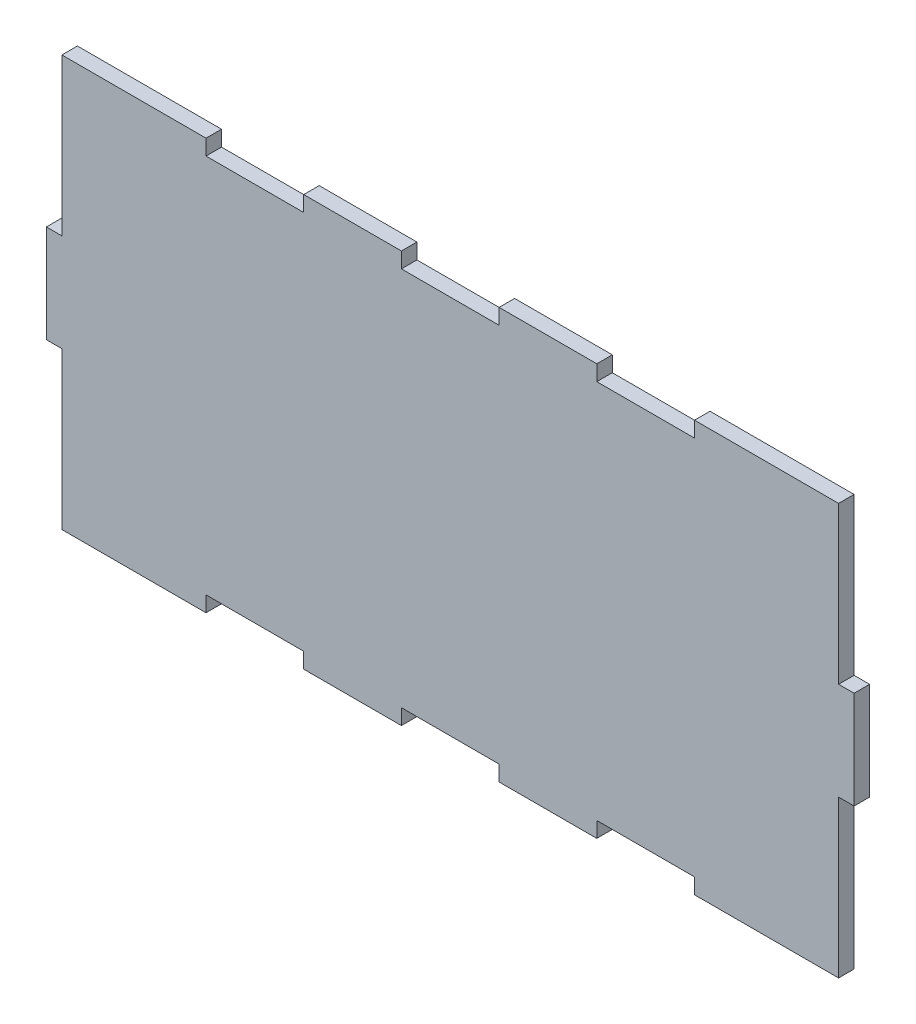
ISO-10303-21;
HEADER;
FILE_DESCRIPTION(('STEP AP214'),'2;1');
FILE_NAME('part.step','',(''),(''),'','','');
FILE_SCHEMA(('AUTOMOTIVE_DESIGN { 1 0 10303 214 1 1 1 1 }'));
ENDSEC;
DATA;
#1=APPLICATION_CONTEXT('core data for automotive mechanical design processes');
#2=APPLICATION_PROTOCOL_DEFINITION('international standard','automotive_design',2000,#1);
#3=PRODUCT_CONTEXT('',#1,'mechanical');
#4=PRODUCT('Part','Part','',(#3));
#5=PRODUCT_RELATED_PRODUCT_CATEGORY('part','',(#4));
#6=PRODUCT_DEFINITION_FORMATION('','',#4);
#7=PRODUCT_DEFINITION_CONTEXT('part definition',#1,'design');
#8=PRODUCT_DEFINITION('design','',#6,#7);
#9=PRODUCT_DEFINITION_SHAPE('','',#8);
#10=(LENGTH_UNIT() NAMED_UNIT(*) SI_UNIT(.MILLI.,.METRE.));
#11=(NAMED_UNIT(*) PLANE_ANGLE_UNIT() SI_UNIT($,.RADIAN.));
#12=(NAMED_UNIT(*) SI_UNIT($,.STERADIAN.) SOLID_ANGLE_UNIT());
#13=UNCERTAINTY_MEASURE_WITH_UNIT(LENGTH_MEASURE(1.E-05),#10,'distance_accuracy_value','');
#14=(GEOMETRIC_REPRESENTATION_CONTEXT(3) GLOBAL_UNCERTAINTY_ASSIGNED_CONTEXT((#13)) GLOBAL_UNIT_ASSIGNED_CONTEXT((#10,
#11,#12)) REPRESENTATION_CONTEXT('',''));
#15=CARTESIAN_POINT('',(0.,0.,0.));
#16=DIRECTION('',(0.,0.,1.));
#17=DIRECTION('',(1.,0.,0.));
#18=AXIS2_PLACEMENT_3D('',#15,#16,#17);
#19=CARTESIAN_POINT('',(-82.675,42.073,3.175));
#20=DIRECTION('',(0.,-1.,0.));
#21=DIRECTION('',(0.,0.,-1.));
#22=AXIS2_PLACEMENT_3D('',#19,#20,#21);
#23=PLANE('',#22);
#24=DIRECTION('',(0.,0.,1.));
#25=VECTOR('',#24,1.);
#26=CARTESIAN_POINT('',(-30.,42.073,0.));
#27=LINE('',#26,#25);
#28=CARTESIAN_POINT('',(-30.,42.073,0.));
#29=VERTEX_POINT('',#28);
#30=CARTESIAN_POINT('',(-30.,42.073,3.175));
#31=VERTEX_POINT('',#30);
#32=EDGE_CURVE('E357',#29,#31,#27,.T.);
#33=ORIENTED_EDGE('',*,*,#32,.T.);
#34=DIRECTION('',(-1.,0.,0.));
#35=VECTOR('',#34,1.);
#36=CARTESIAN_POINT('',(-82.675,42.073,3.175));
#37=LINE('',#36,#35);
#38=CARTESIAN_POINT('',(-9.99999999999999,42.073,3.175));
#39=VERTEX_POINT('',#38);
#40=EDGE_CURVE('E604',#39,#31,#37,.T.);
#41=ORIENTED_EDGE('',*,*,#40,.F.);
#42=DIRECTION('',(0.,0.,1.));
#43=VECTOR('',#42,1.);
#44=CARTESIAN_POINT('',(-9.99999999999999,42.073,0.));
#45=LINE('',#44,#43);
#46=CARTESIAN_POINT('',(-9.99999999999999,42.073,0.));
#47=VERTEX_POINT('',#46);
#48=EDGE_CURVE('E400',#47,#39,#45,.T.);
#49=ORIENTED_EDGE('',*,*,#48,.F.);
#50=DIRECTION('',(-1.,0.,0.));
#51=VECTOR('',#50,1.);
#52=CARTESIAN_POINT('',(-82.675,42.073,0.));
#53=LINE('',#52,#51);
#54=EDGE_CURVE('E583',#47,#29,#53,.T.);
#55=ORIENTED_EDGE('',*,*,#54,.T.);
#56=EDGE_LOOP('',(#33,#41,#49,#55));
#57=FACE_BOUND('',#56,.T.);
#58=ADVANCED_FACE('F41',(#57),#23,.F.);
#59=DIRECTION('',(0.,0.,1.));
#60=VECTOR('',#59,1.);
#61=CARTESIAN_POINT('',(-50.,42.073,0.));
#62=LINE('',#61,#60);
#63=CARTESIAN_POINT('',(-50.,42.073,0.));
#64=VERTEX_POINT('',#63);
#65=CARTESIAN_POINT('',(-50.,42.073,3.175));
#66=VERTEX_POINT('',#65);
#67=EDGE_CURVE('E375',#64,#66,#62,.T.);
#68=ORIENTED_EDGE('',*,*,#67,.F.);
#69=CARTESIAN_POINT('',(-79.5,42.073,0.));
#70=VERTEX_POINT('',#69);
#71=EDGE_CURVE('E578',#64,#70,#53,.T.);
#72=ORIENTED_EDGE('',*,*,#71,.T.);
#73=DIRECTION('',(0.,0.,1.));
#74=VECTOR('',#73,1.);
#75=CARTESIAN_POINT('',(-79.5,42.073,0.));
#76=LINE('',#75,#74);
#77=CARTESIAN_POINT('',(-79.5,42.073,3.175));
#78=VERTEX_POINT('',#77);
#79=EDGE_CURVE('E542',#70,#78,#76,.T.);
#80=ORIENTED_EDGE('',*,*,#79,.T.);
#81=EDGE_CURVE('E326',#66,#78,#37,.T.);
#82=ORIENTED_EDGE('',*,*,#81,.F.);
#83=EDGE_LOOP('',(#68,#72,#80,#82));
#84=FACE_BOUND('',#83,.T.);
#85=ADVANCED_FACE('F735',(#84),#23,.F.);
#86=DIRECTION('',(0.,0.,1.));
#87=VECTOR('',#86,1.);
#88=CARTESIAN_POINT('',(30.,42.073,0.));
#89=LINE('',#88,#87);
#90=CARTESIAN_POINT('',(30.,42.073,0.));
#91=VERTEX_POINT('',#90);
#92=CARTESIAN_POINT('',(30.,42.073,3.175));
#93=VERTEX_POINT('',#92);
#94=EDGE_CURVE('E343',#91,#93,#89,.T.);
#95=ORIENTED_EDGE('',*,*,#94,.F.);
#96=CARTESIAN_POINT('',(9.99999999999999,42.073,0.));
#97=VERTEX_POINT('',#96);
#98=EDGE_CURVE('E297',#91,#97,#53,.T.);
#99=ORIENTED_EDGE('',*,*,#98,.T.);
#100=DIRECTION('',(0.,0.,1.));
#101=VECTOR('',#100,1.);
#102=CARTESIAN_POINT('',(9.99999999999999,42.073,0.));
#103=LINE('',#102,#101);
#104=CARTESIAN_POINT('',(9.99999999999999,42.073,3.175));
#105=VERTEX_POINT('',#104);
#106=EDGE_CURVE('E403',#97,#105,#103,.T.);
#107=ORIENTED_EDGE('',*,*,#106,.T.);
#108=EDGE_CURVE('E325',#93,#105,#37,.T.);
#109=ORIENTED_EDGE('',*,*,#108,.F.);
#110=EDGE_LOOP('',(#95,#99,#107,#109));
#111=FACE_BOUND('',#110,.T.);
#112=ADVANCED_FACE('F597',(#111),#23,.F.);
#113=DIRECTION('',(0.,0.,1.));
#114=VECTOR('',#113,1.);
#115=CARTESIAN_POINT('',(50.,42.073,0.));
#116=LINE('',#115,#114);
#117=CARTESIAN_POINT('',(50.,42.073,0.));
#118=VERTEX_POINT('',#117);
#119=CARTESIAN_POINT('',(50.,42.073,3.175));
#120=VERTEX_POINT('',#119);
#121=EDGE_CURVE('E346',#118,#120,#116,.T.);
#122=ORIENTED_EDGE('',*,*,#121,.T.);
#123=CARTESIAN_POINT('',(79.5,42.073,3.175));
#124=VERTEX_POINT('',#123);
#125=EDGE_CURVE('E318',#124,#120,#37,.T.);
#126=ORIENTED_EDGE('',*,*,#125,.F.);
#127=DIRECTION('',(0.,0.,1.));
#128=VECTOR('',#127,1.);
#129=CARTESIAN_POINT('',(79.5,42.073,0.));
#130=LINE('',#129,#128);
#131=CARTESIAN_POINT('',(79.5,42.073,0.));
#132=VERTEX_POINT('',#131);
#133=EDGE_CURVE('E512',#132,#124,#130,.T.);
#134=ORIENTED_EDGE('',*,*,#133,.F.);
#135=EDGE_CURVE('E584',#132,#118,#53,.T.);
#136=ORIENTED_EDGE('',*,*,#135,.T.);
#137=EDGE_LOOP('',(#122,#126,#134,#136));
#138=FACE_BOUND('',#137,.T.);
#139=ADVANCED_FACE('F737',(#138),#23,.F.);
#140=CARTESIAN_POINT('',(0.,0.,3.175));
#141=DIRECTION('',(0.,0.,-1.));
#142=DIRECTION('',(-1.,0.,0.));
#143=AXIS2_PLACEMENT_3D('',#140,#141,#142);
#144=PLANE('',#143);
#145=DIRECTION('',(0.,-1.,0.));
#146=VECTOR('',#145,1.);
#147=CARTESIAN_POINT('',(-30.,42.073,3.175));
#148=LINE('',#147,#146);
#149=CARTESIAN_POINT('',(-30.,38.898,3.175));
#150=VERTEX_POINT('',#149);
#151=EDGE_CURVE('E358',#31,#150,#148,.T.);
#152=ORIENTED_EDGE('',*,*,#151,.T.);
#153=DIRECTION('',(-1.,0.,0.));
#154=VECTOR('',#153,1.);
#155=CARTESIAN_POINT('',(-30.,38.898,3.175));
#156=LINE('',#155,#154);
#157=CARTESIAN_POINT('',(-50.,38.898,3.175));
#158=VERTEX_POINT('',#157);
#159=EDGE_CURVE('E353',#150,#158,#156,.T.);
#160=ORIENTED_EDGE('',*,*,#159,.T.);
#161=DIRECTION('',(0.,1.,0.));
#162=VECTOR('',#161,1.);
#163=CARTESIAN_POINT('',(-50.,42.073,3.175));
#164=LINE('',#163,#162);
#165=EDGE_CURVE('E363',#158,#66,#164,.T.);
#166=ORIENTED_EDGE('',*,*,#165,.T.);
#167=ORIENTED_EDGE('',*,*,#81,.T.);
#168=DIRECTION('',(0.,1.,0.));
#169=VECTOR('',#168,1.);
#170=CARTESIAN_POINT('',(-79.5,10.,3.175));
#171=LINE('',#170,#169);
#172=CARTESIAN_POINT('',(-79.5,10.,3.175));
#173=VERTEX_POINT('',#172);
#174=EDGE_CURVE('E554',#173,#78,#171,.T.);
#175=ORIENTED_EDGE('',*,*,#174,.F.);
#176=DIRECTION('',(1.,0.,0.));
#177=VECTOR('',#176,1.);
#178=CARTESIAN_POINT('',(-82.675,10.,3.175));
#179=LINE('',#178,#177);
#180=CARTESIAN_POINT('',(-82.675,10.,3.175));
#181=VERTEX_POINT('',#180);
#182=EDGE_CURVE('E501',#181,#173,#179,.T.);
#183=ORIENTED_EDGE('',*,*,#182,.F.);
#184=DIRECTION('',(0.,-1.,0.));
#185=VECTOR('',#184,1.);
#186=CARTESIAN_POINT('',(-82.675,42.073,3.175));
#187=LINE('',#186,#185);
#188=CARTESIAN_POINT('',(-82.675,-10.,3.175));
#189=VERTEX_POINT('',#188);
#190=EDGE_CURVE('E324',#181,#189,#187,.T.);
#191=ORIENTED_EDGE('',*,*,#190,.T.);
#192=DIRECTION('',(-1.,0.,0.));
#193=VECTOR('',#192,1.);
#194=CARTESIAN_POINT('',(-82.675,-10.,3.175));
#195=LINE('',#194,#193);
#196=CARTESIAN_POINT('',(-79.5,-10.,3.175));
#197=VERTEX_POINT('',#196);
#198=EDGE_CURVE('E533',#197,#189,#195,.T.);
#199=ORIENTED_EDGE('',*,*,#198,.F.);
#200=DIRECTION('',(0.,1.,0.));
#201=VECTOR('',#200,1.);
#202=CARTESIAN_POINT('',(-79.5,-42.073,3.175));
#203=LINE('',#202,#201);
#204=CARTESIAN_POINT('',(-79.5,-42.073,3.175));
#205=VERTEX_POINT('',#204);
#206=EDGE_CURVE('E537',#205,#197,#203,.T.);
#207=ORIENTED_EDGE('',*,*,#206,.F.);
#208=DIRECTION('',(1.,0.,0.));
#209=VECTOR('',#208,1.);
#210=CARTESIAN_POINT('',(-82.675,-42.073,3.175));
#211=LINE('',#210,#209);
#212=CARTESIAN_POINT('',(-50.,-42.073,3.175));
#213=VERTEX_POINT('',#212);
#214=EDGE_CURVE('E50',#205,#213,#211,.T.);
#215=ORIENTED_EDGE('',*,*,#214,.T.);
#216=DIRECTION('',(0.,-1.,0.));
#217=VECTOR('',#216,1.);
#218=CARTESIAN_POINT('',(-50.,-42.073,3.175));
#219=LINE('',#218,#217);
#220=CARTESIAN_POINT('',(-50.,-38.898,3.175));
#221=VERTEX_POINT('',#220);
#222=EDGE_CURVE('E451',#221,#213,#219,.T.);
#223=ORIENTED_EDGE('',*,*,#222,.F.);
#224=DIRECTION('',(-1.,0.,0.));
#225=VECTOR('',#224,1.);
#226=CARTESIAN_POINT('',(-30.,-38.898,3.175));
#227=LINE('',#226,#225);
#228=CARTESIAN_POINT('',(-30.,-38.898,3.175));
#229=VERTEX_POINT('',#228);
#230=EDGE_CURVE('E462',#229,#221,#227,.T.);
#231=ORIENTED_EDGE('',*,*,#230,.F.);
#232=DIRECTION('',(0.,1.,0.));
#233=VECTOR('',#232,1.);
#234=CARTESIAN_POINT('',(-30.,-42.073,3.175));
#235=LINE('',#234,#233);
#236=CARTESIAN_POINT('',(-30.,-42.073,3.175));
#237=VERTEX_POINT('',#236);
#238=EDGE_CURVE('E402',#237,#229,#235,.T.);
#239=ORIENTED_EDGE('',*,*,#238,.F.);
#240=CARTESIAN_POINT('',(-9.99999999999999,-42.073,3.175));
#241=VERTEX_POINT('',#240);
#242=EDGE_CURVE('E475',#237,#241,#211,.T.);
#243=ORIENTED_EDGE('',*,*,#242,.T.);
#244=DIRECTION('',(0.,-1.,0.));
#245=VECTOR('',#244,1.);
#246=CARTESIAN_POINT('',(-9.99999999999999,-42.073,3.175));
#247=LINE('',#246,#245);
#248=CARTESIAN_POINT('',(-10.,-38.898,3.175));
#249=VERTEX_POINT('',#248);
#250=EDGE_CURVE('E440',#249,#241,#247,.T.);
#251=ORIENTED_EDGE('',*,*,#250,.F.);
#252=DIRECTION('',(-1.,0.,0.));
#253=VECTOR('',#252,1.);
#254=CARTESIAN_POINT('',(-10.,-38.898,3.175));
#255=LINE('',#254,#253);
#256=CARTESIAN_POINT('',(9.99999999999999,-38.898,3.175));
#257=VERTEX_POINT('',#256);
#258=EDGE_CURVE('E684',#257,#249,#255,.T.);
#259=ORIENTED_EDGE('',*,*,#258,.F.);
#260=DIRECTION('',(0.,1.,0.));
#261=VECTOR('',#260,1.);
#262=CARTESIAN_POINT('',(9.99999999999999,-42.073,3.175));
#263=LINE('',#262,#261);
#264=CARTESIAN_POINT('',(9.99999999999999,-42.073,3.175));
#265=VERTEX_POINT('',#264);
#266=EDGE_CURVE('E651',#265,#257,#263,.T.);
#267=ORIENTED_EDGE('',*,*,#266,.F.);
#268=CARTESIAN_POINT('',(30.,-42.073,3.175));
#269=VERTEX_POINT('',#268);
#270=EDGE_CURVE('E648',#265,#269,#211,.T.);
#271=ORIENTED_EDGE('',*,*,#270,.T.);
#272=DIRECTION('',(0.,-1.,0.));
#273=VECTOR('',#272,1.);
#274=CARTESIAN_POINT('',(30.,-42.073,3.175));
#275=LINE('',#274,#273);
#276=CARTESIAN_POINT('',(30.,-38.898,3.175));
#277=VERTEX_POINT('',#276);
#278=EDGE_CURVE('E420',#277,#269,#275,.T.);
#279=ORIENTED_EDGE('',*,*,#278,.F.);
#280=DIRECTION('',(-1.,0.,0.));
#281=VECTOR('',#280,1.);
#282=CARTESIAN_POINT('',(30.,-38.898,3.175));
#283=LINE('',#282,#281);
#284=CARTESIAN_POINT('',(50.,-38.898,3.175));
#285=VERTEX_POINT('',#284);
#286=EDGE_CURVE('E413',#285,#277,#283,.T.);
#287=ORIENTED_EDGE('',*,*,#286,.F.);
#288=DIRECTION('',(0.,1.,0.));
#289=VECTOR('',#288,1.);
#290=CARTESIAN_POINT('',(50.,-42.073,3.175));
#291=LINE('',#290,#289);
#292=CARTESIAN_POINT('',(50.,-42.073,3.175));
#293=VERTEX_POINT('',#292);
#294=EDGE_CURVE('E424',#293,#285,#291,.T.);
#295=ORIENTED_EDGE('',*,*,#294,.F.);
#296=CARTESIAN_POINT('',(79.5,-42.073,3.175));
#297=VERTEX_POINT('',#296);
#298=EDGE_CURVE('E476',#293,#297,#211,.T.);
#299=ORIENTED_EDGE('',*,*,#298,.T.);
#300=DIRECTION('',(0.,1.,0.));
#301=VECTOR('',#300,1.);
#302=CARTESIAN_POINT('',(79.5,-42.073,3.175));
#303=LINE('',#302,#301);
#304=CARTESIAN_POINT('',(79.5,-10.,3.175));
#305=VERTEX_POINT('',#304);
#306=EDGE_CURVE('E489',#297,#305,#303,.T.);
#307=ORIENTED_EDGE('',*,*,#306,.T.);
#308=DIRECTION('',(1.,0.,0.));
#309=VECTOR('',#308,1.);
#310=CARTESIAN_POINT('',(82.675,-10.,3.175));
#311=LINE('',#310,#309);
#312=CARTESIAN_POINT('',(82.675,-10.,3.175));
#313=VERTEX_POINT('',#312);
#314=EDGE_CURVE('E495',#305,#313,#311,.T.);
#315=ORIENTED_EDGE('',*,*,#314,.T.);
#316=DIRECTION('',(0.,1.,0.));
#317=VECTOR('',#316,1.);
#318=CARTESIAN_POINT('',(82.675,42.073,3.175));
#319=LINE('',#318,#317);
#320=CARTESIAN_POINT('',(82.675,10.,3.175));
#321=VERTEX_POINT('',#320);
#322=EDGE_CURVE('E12',#313,#321,#319,.T.);
#323=ORIENTED_EDGE('',*,*,#322,.T.);
#324=DIRECTION('',(-1.,0.,0.));
#325=VECTOR('',#324,1.);
#326=CARTESIAN_POINT('',(82.675,10.,3.175));
#327=LINE('',#326,#325);
#328=CARTESIAN_POINT('',(79.5,10.,3.175));
#329=VERTEX_POINT('',#328);
#330=EDGE_CURVE('E510',#321,#329,#327,.T.);
#331=ORIENTED_EDGE('',*,*,#330,.T.);
#332=DIRECTION('',(0.,1.,0.));
#333=VECTOR('',#332,1.);
#334=CARTESIAN_POINT('',(79.5,10.,3.175));
#335=LINE('',#334,#333);
#336=EDGE_CURVE('E513',#329,#124,#335,.T.);
#337=ORIENTED_EDGE('',*,*,#336,.T.);
#338=ORIENTED_EDGE('',*,*,#125,.T.);
#339=DIRECTION('',(0.,-1.,0.));
#340=VECTOR('',#339,1.);
#341=CARTESIAN_POINT('',(50.,42.073,3.175));
#342=LINE('',#341,#340);
#343=CARTESIAN_POINT('',(50.,38.898,3.175));
#344=VERTEX_POINT('',#343);
#345=EDGE_CURVE('E298',#120,#344,#342,.T.);
#346=ORIENTED_EDGE('',*,*,#345,.T.);
#347=DIRECTION('',(-1.,0.,0.));
#348=VECTOR('',#347,1.);
#349=CARTESIAN_POINT('',(30.,38.898,3.175));
#350=LINE('',#349,#348);
#351=CARTESIAN_POINT('',(30.,38.898,3.175));
#352=VERTEX_POINT('',#351);
#353=EDGE_CURVE('E302',#344,#352,#350,.T.);
#354=ORIENTED_EDGE('',*,*,#353,.T.);
#355=DIRECTION('',(0.,1.,0.));
#356=VECTOR('',#355,1.);
#357=CARTESIAN_POINT('',(30.,42.073,3.175));
#358=LINE('',#357,#356);
#359=EDGE_CURVE('E289',#352,#93,#358,.T.);
#360=ORIENTED_EDGE('',*,*,#359,.T.);
#361=ORIENTED_EDGE('',*,*,#108,.T.);
#362=DIRECTION('',(0.,-1.,0.));
#363=VECTOR('',#362,1.);
#364=CARTESIAN_POINT('',(9.99999999999999,42.073,3.175));
#365=LINE('',#364,#363);
#366=CARTESIAN_POINT('',(9.99999999999999,38.898,3.175));
#367=VERTEX_POINT('',#366);
#368=EDGE_CURVE('E382',#105,#367,#365,.T.);
#369=ORIENTED_EDGE('',*,*,#368,.T.);
#370=DIRECTION('',(-1.,0.,0.));
#371=VECTOR('',#370,1.);
#372=CARTESIAN_POINT('',(-10.,38.898,3.175));
#373=LINE('',#372,#371);
#374=CARTESIAN_POINT('',(-10.,38.898,3.175));
#375=VERTEX_POINT('',#374);
#376=EDGE_CURVE('E392',#367,#375,#373,.T.);
#377=ORIENTED_EDGE('',*,*,#376,.T.);
#378=DIRECTION('',(0.,1.,0.));
#379=VECTOR('',#378,1.);
#380=CARTESIAN_POINT('',(-9.99999999999999,42.073,3.175));
#381=LINE('',#380,#379);
#382=EDGE_CURVE('E345',#375,#39,#381,.T.);
#383=ORIENTED_EDGE('',*,*,#382,.T.);
#384=ORIENTED_EDGE('',*,*,#40,.T.);
#385=EDGE_LOOP('',(#152,#160,#166,#167,#175,#183,#191,#199,#207,#215,#223,#231,#239,#243,#251,
#259,#267,#271,#279,#287,#295,#299,#307,#315,#323,#331,#337,#338,#346,#354,#360,#361,#369,#377,
#383,#384));
#386=FACE_BOUND('',#385,.T.);
#387=ADVANCED_FACE('F601',(#386),#144,.F.);
#388=CARTESIAN_POINT('',(0.,0.,0.));
#389=DIRECTION('',(0.,0.,-1.));
#390=DIRECTION('',(-1.,0.,0.));
#391=AXIS2_PLACEMENT_3D('',#388,#389,#390);
#392=PLANE('',#391);
#393=DIRECTION('',(-1.,0.,0.));
#394=VECTOR('',#393,1.);
#395=CARTESIAN_POINT('',(-30.,38.898,0.));
#396=LINE('',#395,#394);
#397=CARTESIAN_POINT('',(-30.,38.898,0.));
#398=VERTEX_POINT('',#397);
#399=CARTESIAN_POINT('',(-50.,38.898,0.));
#400=VERTEX_POINT('',#399);
#401=EDGE_CURVE('E355',#398,#400,#396,.T.);
#402=ORIENTED_EDGE('',*,*,#401,.F.);
#403=DIRECTION('',(0.,-1.,0.));
#404=VECTOR('',#403,1.);
#405=CARTESIAN_POINT('',(-30.,42.073,0.));
#406=LINE('',#405,#404);
#407=EDGE_CURVE('E350',#29,#398,#406,.T.);
#408=ORIENTED_EDGE('',*,*,#407,.F.);
#409=ORIENTED_EDGE('',*,*,#54,.F.);
#410=DIRECTION('',(0.,1.,0.));
#411=VECTOR('',#410,1.);
#412=CARTESIAN_POINT('',(-9.99999999999999,42.073,0.));
#413=LINE('',#412,#411);
#414=CARTESIAN_POINT('',(-10.,38.898,0.));
#415=VERTEX_POINT('',#414);
#416=EDGE_CURVE('E379',#415,#47,#413,.T.);
#417=ORIENTED_EDGE('',*,*,#416,.F.);
#418=DIRECTION('',(-1.,0.,0.));
#419=VECTOR('',#418,1.);
#420=CARTESIAN_POINT('',(-10.,38.898,0.));
#421=LINE('',#420,#419);
#422=CARTESIAN_POINT('',(9.99999999999999,38.898,0.));
#423=VERTEX_POINT('',#422);
#424=EDGE_CURVE('E381',#423,#415,#421,.T.);
#425=ORIENTED_EDGE('',*,*,#424,.F.);
#426=DIRECTION('',(0.,-1.,0.));
#427=VECTOR('',#426,1.);
#428=CARTESIAN_POINT('',(9.99999999999999,42.073,0.));
#429=LINE('',#428,#427);
#430=EDGE_CURVE('E384',#97,#423,#429,.T.);
#431=ORIENTED_EDGE('',*,*,#430,.F.);
#432=ORIENTED_EDGE('',*,*,#98,.F.);
#433=DIRECTION('',(0.,1.,0.));
#434=VECTOR('',#433,1.);
#435=CARTESIAN_POINT('',(30.,42.073,0.));
#436=LINE('',#435,#434);
#437=CARTESIAN_POINT('',(30.,38.898,0.));
#438=VERTEX_POINT('',#437);
#439=EDGE_CURVE('E283',#438,#91,#436,.T.);
#440=ORIENTED_EDGE('',*,*,#439,.F.);
#441=DIRECTION('',(-1.,0.,0.));
#442=VECTOR('',#441,1.);
#443=CARTESIAN_POINT('',(30.,38.898,0.));
#444=LINE('',#443,#442);
#445=CARTESIAN_POINT('',(50.,38.898,0.));
#446=VERTEX_POINT('',#445);
#447=EDGE_CURVE('E274',#446,#438,#444,.T.);
#448=ORIENTED_EDGE('',*,*,#447,.F.);
#449=DIRECTION('',(0.,-1.,0.));
#450=VECTOR('',#449,1.);
#451=CARTESIAN_POINT('',(50.,42.073,0.));
#452=LINE('',#451,#450);
#453=EDGE_CURVE('E282',#118,#446,#452,.T.);
#454=ORIENTED_EDGE('',*,*,#453,.F.);
#455=ORIENTED_EDGE('',*,*,#135,.F.);
#456=DIRECTION('',(0.,1.,0.));
#457=VECTOR('',#456,1.);
#458=CARTESIAN_POINT('',(79.5,10.,0.));
#459=LINE('',#458,#457);
#460=CARTESIAN_POINT('',(79.5,10.,0.));
#461=VERTEX_POINT('',#460);
#462=EDGE_CURVE('E507',#461,#132,#459,.T.);
#463=ORIENTED_EDGE('',*,*,#462,.F.);
#464=DIRECTION('',(-1.,0.,0.));
#465=VECTOR('',#464,1.);
#466=CARTESIAN_POINT('',(82.675,10.,0.));
#467=LINE('',#466,#465);
#468=CARTESIAN_POINT('',(82.675,10.,0.));
#469=VERTEX_POINT('',#468);
#470=EDGE_CURVE('E509',#469,#461,#467,.T.);
#471=ORIENTED_EDGE('',*,*,#470,.F.);
#472=DIRECTION('',(0.,1.,0.));
#473=VECTOR('',#472,1.);
#474=CARTESIAN_POINT('',(82.675,42.073,0.));
#475=LINE('',#474,#473);
#476=CARTESIAN_POINT('',(82.675,-10.,0.));
#477=VERTEX_POINT('',#476);
#478=EDGE_CURVE('E44',#477,#469,#475,.T.);
#479=ORIENTED_EDGE('',*,*,#478,.F.);
#480=DIRECTION('',(1.,0.,0.));
#481=VECTOR('',#480,1.);
#482=CARTESIAN_POINT('',(82.675,-10.,0.));
#483=LINE('',#482,#481);
#484=CARTESIAN_POINT('',(79.5,-10.,0.));
#485=VERTEX_POINT('',#484);
#486=EDGE_CURVE('E494',#485,#477,#483,.T.);
#487=ORIENTED_EDGE('',*,*,#486,.F.);
#488=DIRECTION('',(0.,1.,0.));
#489=VECTOR('',#488,1.);
#490=CARTESIAN_POINT('',(79.5,-42.073,0.));
#491=LINE('',#490,#489);
#492=CARTESIAN_POINT('',(79.5,-42.073,0.));
#493=VERTEX_POINT('',#492);
#494=EDGE_CURVE('E506',#493,#485,#491,.T.);
#495=ORIENTED_EDGE('',*,*,#494,.F.);
#496=DIRECTION('',(1.,0.,0.));
#497=VECTOR('',#496,1.);
#498=CARTESIAN_POINT('',(-82.675,-42.073,0.));
#499=LINE('',#498,#497);
#500=CARTESIAN_POINT('',(50.,-42.073,0.));
#501=VERTEX_POINT('',#500);
#502=EDGE_CURVE('E595',#501,#493,#499,.T.);
#503=ORIENTED_EDGE('',*,*,#502,.F.);
#504=DIRECTION('',(0.,1.,0.));
#505=VECTOR('',#504,1.);
#506=CARTESIAN_POINT('',(50.,-42.073,0.));
#507=LINE('',#506,#505);
#508=CARTESIAN_POINT('',(50.,-38.898,0.));
#509=VERTEX_POINT('',#508);
#510=EDGE_CURVE('E412',#501,#509,#507,.T.);
#511=ORIENTED_EDGE('',*,*,#510,.T.);
#512=DIRECTION('',(-1.,0.,0.));
#513=VECTOR('',#512,1.);
#514=CARTESIAN_POINT('',(30.,-38.898,0.));
#515=LINE('',#514,#513);
#516=CARTESIAN_POINT('',(30.,-38.898,0.));
#517=VERTEX_POINT('',#516);
#518=EDGE_CURVE('E416',#509,#517,#515,.T.);
#519=ORIENTED_EDGE('',*,*,#518,.T.);
#520=DIRECTION('',(0.,-1.,0.));
#521=VECTOR('',#520,1.);
#522=CARTESIAN_POINT('',(30.,-42.073,0.));
#523=LINE('',#522,#521);
#524=CARTESIAN_POINT('',(30.,-42.073,0.));
#525=VERTEX_POINT('',#524);
#526=EDGE_CURVE('E409',#517,#525,#523,.T.);
#527=ORIENTED_EDGE('',*,*,#526,.T.);
#528=CARTESIAN_POINT('',(9.99999999999999,-42.073,0.));
#529=VERTEX_POINT('',#528);
#530=EDGE_CURVE('E625',#529,#525,#499,.T.);
#531=ORIENTED_EDGE('',*,*,#530,.F.);
#532=DIRECTION('',(0.,1.,0.));
#533=VECTOR('',#532,1.);
#534=CARTESIAN_POINT('',(9.99999999999999,-42.073,0.));
#535=LINE('',#534,#533);
#536=CARTESIAN_POINT('',(9.99999999999999,-38.898,0.));
#537=VERTEX_POINT('',#536);
#538=EDGE_CURVE('E640',#529,#537,#535,.T.);
#539=ORIENTED_EDGE('',*,*,#538,.T.);
#540=DIRECTION('',(-1.,0.,0.));
#541=VECTOR('',#540,1.);
#542=CARTESIAN_POINT('',(-10.,-38.898,0.));
#543=LINE('',#542,#541);
#544=CARTESIAN_POINT('',(-10.,-38.898,0.));
#545=VERTEX_POINT('',#544);
#546=EDGE_CURVE('E686',#537,#545,#543,.T.);
#547=ORIENTED_EDGE('',*,*,#546,.T.);
#548=DIRECTION('',(0.,-1.,0.));
#549=VECTOR('',#548,1.);
#550=CARTESIAN_POINT('',(-9.99999999999999,-42.073,0.));
#551=LINE('',#550,#549);
#552=CARTESIAN_POINT('',(-9.99999999999999,-42.073,0.));
#553=VERTEX_POINT('',#552);
#554=EDGE_CURVE('E681',#545,#553,#551,.T.);
#555=ORIENTED_EDGE('',*,*,#554,.T.);
#556=CARTESIAN_POINT('',(-30.,-42.073,0.));
#557=VERTEX_POINT('',#556);
#558=EDGE_CURVE('E619',#557,#553,#499,.T.);
#559=ORIENTED_EDGE('',*,*,#558,.F.);
#560=DIRECTION('',(0.,1.,0.));
#561=VECTOR('',#560,1.);
#562=CARTESIAN_POINT('',(-30.,-42.073,0.));
#563=LINE('',#562,#561);
#564=CARTESIAN_POINT('',(-30.,-38.898,0.));
#565=VERTEX_POINT('',#564);
#566=EDGE_CURVE('E447',#557,#565,#563,.T.);
#567=ORIENTED_EDGE('',*,*,#566,.T.);
#568=DIRECTION('',(-1.,0.,0.));
#569=VECTOR('',#568,1.);
#570=CARTESIAN_POINT('',(-30.,-38.898,0.));
#571=LINE('',#570,#569);
#572=CARTESIAN_POINT('',(-50.,-38.898,0.));
#573=VERTEX_POINT('',#572);
#574=EDGE_CURVE('E450',#565,#573,#571,.T.);
#575=ORIENTED_EDGE('',*,*,#574,.T.);
#576=DIRECTION('',(0.,-1.,0.));
#577=VECTOR('',#576,1.);
#578=CARTESIAN_POINT('',(-50.,-42.073,0.));
#579=LINE('',#578,#577);
#580=CARTESIAN_POINT('',(-50.,-42.073,0.));
#581=VERTEX_POINT('',#580);
#582=EDGE_CURVE('E454',#573,#581,#579,.T.);
#583=ORIENTED_EDGE('',*,*,#582,.T.);
#584=CARTESIAN_POINT('',(-79.5,-42.073,0.));
#585=VERTEX_POINT('',#584);
#586=EDGE_CURVE('E614',#585,#581,#499,.T.);
#587=ORIENTED_EDGE('',*,*,#586,.F.);
#588=DIRECTION('',(0.,1.,0.));
#589=VECTOR('',#588,1.);
#590=CARTESIAN_POINT('',(-79.5,-42.073,0.));
#591=LINE('',#590,#589);
#592=CARTESIAN_POINT('',(-79.5,-10.,0.));
#593=VERTEX_POINT('',#592);
#594=EDGE_CURVE('E529',#585,#593,#591,.T.);
#595=ORIENTED_EDGE('',*,*,#594,.T.);
#596=DIRECTION('',(-1.,0.,0.));
#597=VECTOR('',#596,1.);
#598=CARTESIAN_POINT('',(-82.675,-10.,0.));
#599=LINE('',#598,#597);
#600=CARTESIAN_POINT('',(-82.675,-10.,0.));
#601=VERTEX_POINT('',#600);
#602=EDGE_CURVE('E532',#593,#601,#599,.T.);
#603=ORIENTED_EDGE('',*,*,#602,.T.);
#604=DIRECTION('',(0.,-1.,0.));
#605=VECTOR('',#604,1.);
#606=CARTESIAN_POINT('',(-82.675,42.073,0.));
#607=LINE('',#606,#605);
#608=CARTESIAN_POINT('',(-82.675,10.,0.));
#609=VERTEX_POINT('',#608);
#610=EDGE_CURVE('E591',#609,#601,#607,.T.);
#611=ORIENTED_EDGE('',*,*,#610,.F.);
#612=DIRECTION('',(1.,0.,0.));
#613=VECTOR('',#612,1.);
#614=CARTESIAN_POINT('',(-82.675,10.,0.));
#615=LINE('',#614,#613);
#616=CARTESIAN_POINT('',(-79.5,10.,0.));
#617=VERTEX_POINT('',#616);
#618=EDGE_CURVE('E561',#609,#617,#615,.T.);
#619=ORIENTED_EDGE('',*,*,#618,.T.);
#620=DIRECTION('',(0.,1.,0.));
#621=VECTOR('',#620,1.);
#622=CARTESIAN_POINT('',(-79.5,10.,0.));
#623=LINE('',#622,#621);
#624=EDGE_CURVE('E555',#617,#70,#623,.T.);
#625=ORIENTED_EDGE('',*,*,#624,.T.);
#626=ORIENTED_EDGE('',*,*,#71,.F.);
#627=DIRECTION('',(0.,1.,0.));
#628=VECTOR('',#627,1.);
#629=CARTESIAN_POINT('',(-50.,42.073,0.));
#630=LINE('',#629,#628);
#631=EDGE_CURVE('E352',#400,#64,#630,.T.);
#632=ORIENTED_EDGE('',*,*,#631,.F.);
#633=EDGE_LOOP('',(#402,#408,#409,#417,#425,#431,#432,#440,#448,#454,#455,#463,#471,#479,#487,
#495,#503,#511,#519,#527,#531,#539,#547,#555,#559,#567,#575,#583,#587,#595,#603,#611,#619,#625,
#626,#632));
#634=FACE_BOUND('',#633,.T.);
#635=ADVANCED_FACE('F294',(#634),#392,.T.);
#636=CARTESIAN_POINT('',(-82.675,-42.073,3.175));
#637=DIRECTION('',(0.,1.,0.));
#638=DIRECTION('',(0.,0.,1.));
#639=AXIS2_PLACEMENT_3D('',#636,#637,#638);
#640=PLANE('',#639);
#641=ORIENTED_EDGE('',*,*,#242,.F.);
#642=DIRECTION('',(0.,0.,1.));
#643=VECTOR('',#642,1.);
#644=CARTESIAN_POINT('',(-30.,-42.073,0.));
#645=LINE('',#644,#643);
#646=EDGE_CURVE('E425',#557,#237,#645,.T.);
#647=ORIENTED_EDGE('',*,*,#646,.F.);
#648=ORIENTED_EDGE('',*,*,#558,.T.);
#649=DIRECTION('',(0.,0.,1.));
#650=VECTOR('',#649,1.);
#651=CARTESIAN_POINT('',(-9.99999999999999,-42.073,0.));
#652=LINE('',#651,#650);
#653=EDGE_CURVE('E687',#553,#241,#652,.T.);
#654=ORIENTED_EDGE('',*,*,#653,.T.);
#655=EDGE_LOOP('',(#641,#647,#648,#654));
#656=FACE_BOUND('',#655,.T.);
#657=ADVANCED_FACE('F815',(#656),#640,.F.);
#658=ORIENTED_EDGE('',*,*,#530,.T.);
#659=DIRECTION('',(0.,0.,1.));
#660=VECTOR('',#659,1.);
#661=CARTESIAN_POINT('',(30.,-42.073,0.));
#662=LINE('',#661,#660);
#663=EDGE_CURVE('E419',#525,#269,#662,.T.);
#664=ORIENTED_EDGE('',*,*,#663,.T.);
#665=ORIENTED_EDGE('',*,*,#270,.F.);
#666=DIRECTION('',(0.,0.,1.));
#667=VECTOR('',#666,1.);
#668=CARTESIAN_POINT('',(9.99999999999999,-42.073,0.));
#669=LINE('',#668,#667);
#670=EDGE_CURVE('E637',#529,#265,#669,.T.);
#671=ORIENTED_EDGE('',*,*,#670,.F.);
#672=EDGE_LOOP('',(#658,#664,#665,#671));
#673=FACE_BOUND('',#672,.T.);
#674=ADVANCED_FACE('F634',(#673),#640,.F.);
#675=ORIENTED_EDGE('',*,*,#586,.T.);
#676=DIRECTION('',(0.,0.,1.));
#677=VECTOR('',#676,1.);
#678=CARTESIAN_POINT('',(-50.,-42.073,0.));
#679=LINE('',#678,#677);
#680=EDGE_CURVE('E673',#581,#213,#679,.T.);
#681=ORIENTED_EDGE('',*,*,#680,.T.);
#682=ORIENTED_EDGE('',*,*,#214,.F.);
#683=DIRECTION('',(0.,0.,1.));
#684=VECTOR('',#683,1.);
#685=CARTESIAN_POINT('',(-79.5,-42.073,0.));
#686=LINE('',#685,#684);
#687=EDGE_CURVE('E536',#585,#205,#686,.T.);
#688=ORIENTED_EDGE('',*,*,#687,.F.);
#689=EDGE_LOOP('',(#675,#681,#682,#688));
#690=FACE_BOUND('',#689,.T.);
#691=ADVANCED_FACE('F672',(#690),#640,.F.);
#692=ORIENTED_EDGE('',*,*,#298,.F.);
#693=DIRECTION('',(0.,0.,1.));
#694=VECTOR('',#693,1.);
#695=CARTESIAN_POINT('',(50.,-42.073,0.));
#696=LINE('',#695,#694);
#697=EDGE_CURVE('E443',#501,#293,#696,.T.);
#698=ORIENTED_EDGE('',*,*,#697,.F.);
#699=ORIENTED_EDGE('',*,*,#502,.T.);
#700=DIRECTION('',(0.,0.,1.));
#701=VECTOR('',#700,1.);
#702=CARTESIAN_POINT('',(79.5,-42.073,0.));
#703=LINE('',#702,#701);
#704=EDGE_CURVE('E498',#493,#297,#703,.T.);
#705=ORIENTED_EDGE('',*,*,#704,.T.);
#706=EDGE_LOOP('',(#692,#698,#699,#705));
#707=FACE_BOUND('',#706,.T.);
#708=ADVANCED_FACE('F716',(#707),#640,.F.);
#709=CARTESIAN_POINT('',(82.675,42.073,3.175));
#710=DIRECTION('',(-1.,0.,0.));
#711=DIRECTION('',(0.,0.,1.));
#712=AXIS2_PLACEMENT_3D('',#709,#710,#711);
#713=PLANE('',#712);
#714=DIRECTION('',(0.,0.,1.));
#715=VECTOR('',#714,1.);
#716=CARTESIAN_POINT('',(82.675,-10.,0.));
#717=LINE('',#716,#715);
#718=EDGE_CURVE('E504',#477,#313,#717,.T.);
#719=ORIENTED_EDGE('',*,*,#718,.F.);
#720=ORIENTED_EDGE('',*,*,#478,.T.);
#721=DIRECTION('',(0.,0.,1.));
#722=VECTOR('',#721,1.);
#723=CARTESIAN_POINT('',(82.675,10.,0.));
#724=LINE('',#723,#722);
#725=EDGE_CURVE('E523',#469,#321,#724,.T.);
#726=ORIENTED_EDGE('',*,*,#725,.T.);
#727=ORIENTED_EDGE('',*,*,#322,.F.);
#728=EDGE_LOOP('',(#719,#720,#726,#727));
#729=FACE_BOUND('',#728,.T.);
#730=ADVANCED_FACE('F714',(#729),#713,.F.);
#731=CARTESIAN_POINT('',(-82.675,42.073,3.175));
#732=DIRECTION('',(1.,0.,0.));
#733=DIRECTION('',(0.,0.,-1.));
#734=AXIS2_PLACEMENT_3D('',#731,#732,#733);
#735=PLANE('',#734);
#736=ORIENTED_EDGE('',*,*,#610,.T.);
#737=DIRECTION('',(0.,0.,1.));
#738=VECTOR('',#737,1.);
#739=CARTESIAN_POINT('',(-82.675,-10.,0.));
#740=LINE('',#739,#738);
#741=EDGE_CURVE('E576',#601,#189,#740,.T.);
#742=ORIENTED_EDGE('',*,*,#741,.T.);
#743=ORIENTED_EDGE('',*,*,#190,.F.);
#744=DIRECTION('',(0.,0.,1.));
#745=VECTOR('',#744,1.);
#746=CARTESIAN_POINT('',(-82.675,10.,0.));
#747=LINE('',#746,#745);
#748=EDGE_CURVE('E327',#609,#181,#747,.T.);
#749=ORIENTED_EDGE('',*,*,#748,.F.);
#750=EDGE_LOOP('',(#736,#742,#743,#749));
#751=FACE_BOUND('',#750,.T.);
#752=ADVANCED_FACE('F664',(#751),#735,.F.);
#753=CARTESIAN_POINT('',(-79.5,10.,0.));
#754=DIRECTION('',(1.,0.,0.));
#755=DIRECTION('',(0.,0.,-1.));
#756=AXIS2_PLACEMENT_3D('',#753,#754,#755);
#757=PLANE('',#756);
#758=ORIENTED_EDGE('',*,*,#174,.T.);
#759=ORIENTED_EDGE('',*,*,#79,.F.);
#760=ORIENTED_EDGE('',*,*,#624,.F.);
#761=DIRECTION('',(0.,0.,1.));
#762=VECTOR('',#761,1.);
#763=CARTESIAN_POINT('',(-79.5,10.,0.));
#764=LINE('',#763,#762);
#765=EDGE_CURVE('E563',#617,#173,#764,.T.);
#766=ORIENTED_EDGE('',*,*,#765,.T.);
#767=EDGE_LOOP('',(#758,#759,#760,#766));
#768=FACE_BOUND('',#767,.T.);
#769=ADVANCED_FACE('F801',(#768),#757,.F.);
#770=CARTESIAN_POINT('',(-82.675,10.,0.));
#771=DIRECTION('',(0.,-1.,0.));
#772=DIRECTION('',(0.,0.,-1.));
#773=AXIS2_PLACEMENT_3D('',#770,#771,#772);
#774=PLANE('',#773);
#775=ORIENTED_EDGE('',*,*,#182,.T.);
#776=ORIENTED_EDGE('',*,*,#765,.F.);
#777=ORIENTED_EDGE('',*,*,#618,.F.);
#778=ORIENTED_EDGE('',*,*,#748,.T.);
#779=EDGE_LOOP('',(#775,#776,#777,#778));
#780=FACE_BOUND('',#779,.T.);
#781=ADVANCED_FACE('F802',(#780),#774,.F.);
#782=CARTESIAN_POINT('',(-82.675,-10.,0.));
#783=DIRECTION('',(0.,1.,0.));
#784=DIRECTION('',(-1.,0.,0.));
#785=AXIS2_PLACEMENT_3D('',#782,#783,#784);
#786=PLANE('',#785);
#787=ORIENTED_EDGE('',*,*,#198,.T.);
#788=ORIENTED_EDGE('',*,*,#741,.F.);
#789=ORIENTED_EDGE('',*,*,#602,.F.);
#790=DIRECTION('',(0.,0.,1.));
#791=VECTOR('',#790,1.);
#792=CARTESIAN_POINT('',(-79.5,-10.,0.));
#793=LINE('',#792,#791);
#794=EDGE_CURVE('E575',#593,#197,#793,.T.);
#795=ORIENTED_EDGE('',*,*,#794,.T.);
#796=EDGE_LOOP('',(#787,#788,#789,#795));
#797=FACE_BOUND('',#796,.T.);
#798=ADVANCED_FACE('F667',(#797),#786,.F.);
#799=CARTESIAN_POINT('',(-79.5,-42.073,0.));
#800=DIRECTION('',(1.,0.,0.));
#801=DIRECTION('',(0.,0.,-1.));
#802=AXIS2_PLACEMENT_3D('',#799,#800,#801);
#803=PLANE('',#802);
#804=ORIENTED_EDGE('',*,*,#206,.T.);
#805=ORIENTED_EDGE('',*,*,#794,.F.);
#806=ORIENTED_EDGE('',*,*,#594,.F.);
#807=ORIENTED_EDGE('',*,*,#687,.T.);
#808=EDGE_LOOP('',(#804,#805,#806,#807));
#809=FACE_BOUND('',#808,.T.);
#810=ADVANCED_FACE('F669',(#809),#803,.F.);
#811=CARTESIAN_POINT('',(82.675,10.,0.));
#812=DIRECTION('',(0.,1.,0.));
#813=DIRECTION('',(0.,0.,1.));
#814=AXIS2_PLACEMENT_3D('',#811,#812,#813);
#815=PLANE('',#814);
#816=ORIENTED_EDGE('',*,*,#330,.F.);
#817=ORIENTED_EDGE('',*,*,#725,.F.);
#818=ORIENTED_EDGE('',*,*,#470,.T.);
#819=DIRECTION('',(0.,0.,1.));
#820=VECTOR('',#819,1.);
#821=CARTESIAN_POINT('',(79.5,10.,0.));
#822=LINE('',#821,#820);
#823=EDGE_CURVE('E526',#461,#329,#822,.T.);
#824=ORIENTED_EDGE('',*,*,#823,.T.);
#825=EDGE_LOOP('',(#816,#817,#818,#824));
#826=FACE_BOUND('',#825,.T.);
#827=ADVANCED_FACE('F846',(#826),#815,.T.);
#828=CARTESIAN_POINT('',(79.5,10.,0.));
#829=DIRECTION('',(1.,0.,0.));
#830=DIRECTION('',(0.,0.,-1.));
#831=AXIS2_PLACEMENT_3D('',#828,#829,#830);
#832=PLANE('',#831);
#833=ORIENTED_EDGE('',*,*,#336,.F.);
#834=ORIENTED_EDGE('',*,*,#823,.F.);
#835=ORIENTED_EDGE('',*,*,#462,.T.);
#836=ORIENTED_EDGE('',*,*,#133,.T.);
#837=EDGE_LOOP('',(#833,#834,#835,#836));
#838=FACE_BOUND('',#837,.T.);
#839=ADVANCED_FACE('F751',(#838),#832,.T.);
#840=CARTESIAN_POINT('',(79.5,-42.073,0.));
#841=DIRECTION('',(1.,0.,0.));
#842=DIRECTION('',(0.,0.,-1.));
#843=AXIS2_PLACEMENT_3D('',#840,#841,#842);
#844=PLANE('',#843);
#845=ORIENTED_EDGE('',*,*,#306,.F.);
#846=ORIENTED_EDGE('',*,*,#704,.F.);
#847=ORIENTED_EDGE('',*,*,#494,.T.);
#848=DIRECTION('',(0.,0.,1.));
#849=VECTOR('',#848,1.);
#850=CARTESIAN_POINT('',(79.5,-10.,0.));
#851=LINE('',#850,#849);
#852=EDGE_CURVE('E502',#485,#305,#851,.T.);
#853=ORIENTED_EDGE('',*,*,#852,.T.);
#854=EDGE_LOOP('',(#845,#846,#847,#853));
#855=FACE_BOUND('',#854,.T.);
#856=ADVANCED_FACE('F707',(#855),#844,.T.);
#857=CARTESIAN_POINT('',(82.675,-10.,0.));
#858=DIRECTION('',(0.,-1.,0.));
#859=DIRECTION('',(1.,0.,0.));
#860=AXIS2_PLACEMENT_3D('',#857,#858,#859);
#861=PLANE('',#860);
#862=ORIENTED_EDGE('',*,*,#314,.F.);
#863=ORIENTED_EDGE('',*,*,#852,.F.);
#864=ORIENTED_EDGE('',*,*,#486,.T.);
#865=ORIENTED_EDGE('',*,*,#718,.T.);
#866=EDGE_LOOP('',(#862,#863,#864,#865));
#867=FACE_BOUND('',#866,.T.);
#868=ADVANCED_FACE('F711',(#867),#861,.T.);
#869=CARTESIAN_POINT('',(-9.99999999999999,-42.073,0.));
#870=DIRECTION('',(-1.,0.,0.));
#871=DIRECTION('',(0.,-1.,0.));
#872=AXIS2_PLACEMENT_3D('',#869,#870,#871);
#873=PLANE('',#872);
#874=ORIENTED_EDGE('',*,*,#250,.T.);
#875=ORIENTED_EDGE('',*,*,#653,.F.);
#876=ORIENTED_EDGE('',*,*,#554,.F.);
#877=DIRECTION('',(0.,0.,1.));
#878=VECTOR('',#877,1.);
#879=CARTESIAN_POINT('',(-10.,-38.898,0.));
#880=LINE('',#879,#878);
#881=EDGE_CURVE('E518',#545,#249,#880,.T.);
#882=ORIENTED_EDGE('',*,*,#881,.T.);
#883=EDGE_LOOP('',(#874,#875,#876,#882));
#884=FACE_BOUND('',#883,.T.);
#885=ADVANCED_FACE('F885',(#884),#873,.F.);
#886=CARTESIAN_POINT('',(-10.,-38.898,0.));
#887=DIRECTION('',(0.,1.,0.));
#888=DIRECTION('',(0.,0.,1.));
#889=AXIS2_PLACEMENT_3D('',#886,#887,#888);
#890=PLANE('',#889);
#891=ORIENTED_EDGE('',*,*,#258,.T.);
#892=ORIENTED_EDGE('',*,*,#881,.F.);
#893=ORIENTED_EDGE('',*,*,#546,.F.);
#894=DIRECTION('',(0.,0.,1.));
#895=VECTOR('',#894,1.);
#896=CARTESIAN_POINT('',(9.99999999999999,-38.898,0.));
#897=LINE('',#896,#895);
#898=EDGE_CURVE('E698',#537,#257,#897,.T.);
#899=ORIENTED_EDGE('',*,*,#898,.T.);
#900=EDGE_LOOP('',(#891,#892,#893,#899));
#901=FACE_BOUND('',#900,.T.);
#902=ADVANCED_FACE('F921',(#901),#890,.F.);
#903=CARTESIAN_POINT('',(9.99999999999999,-42.073,0.));
#904=DIRECTION('',(1.,0.,0.));
#905=DIRECTION('',(0.,0.,-1.));
#906=AXIS2_PLACEMENT_3D('',#903,#904,#905);
#907=PLANE('',#906);
#908=ORIENTED_EDGE('',*,*,#266,.T.);
#909=ORIENTED_EDGE('',*,*,#898,.F.);
#910=ORIENTED_EDGE('',*,*,#538,.F.);
#911=ORIENTED_EDGE('',*,*,#670,.T.);
#912=EDGE_LOOP('',(#908,#909,#910,#911));
#913=FACE_BOUND('',#912,.T.);
#914=ADVANCED_FACE('F731',(#913),#907,.F.);
#915=CARTESIAN_POINT('',(30.,-42.073,0.));
#916=DIRECTION('',(-1.,0.,0.));
#917=DIRECTION('',(0.,0.,1.));
#918=AXIS2_PLACEMENT_3D('',#915,#916,#917);
#919=PLANE('',#918);
#920=ORIENTED_EDGE('',*,*,#278,.T.);
#921=ORIENTED_EDGE('',*,*,#663,.F.);
#922=ORIENTED_EDGE('',*,*,#526,.F.);
#923=DIRECTION('',(0.,0.,1.));
#924=VECTOR('',#923,1.);
#925=CARTESIAN_POINT('',(30.,-38.898,0.));
#926=LINE('',#925,#924);
#927=EDGE_CURVE('E438',#517,#277,#926,.T.);
#928=ORIENTED_EDGE('',*,*,#927,.T.);
#929=EDGE_LOOP('',(#920,#921,#922,#928));
#930=FACE_BOUND('',#929,.T.);
#931=ADVANCED_FACE('F643',(#930),#919,.F.);
#932=CARTESIAN_POINT('',(30.,-38.898,0.));
#933=DIRECTION('',(0.,1.,0.));
#934=DIRECTION('',(-1.,0.,0.));
#935=AXIS2_PLACEMENT_3D('',#932,#933,#934);
#936=PLANE('',#935);
#937=ORIENTED_EDGE('',*,*,#286,.T.);
#938=ORIENTED_EDGE('',*,*,#927,.F.);
#939=ORIENTED_EDGE('',*,*,#518,.F.);
#940=DIRECTION('',(0.,0.,1.));
#941=VECTOR('',#940,1.);
#942=CARTESIAN_POINT('',(50.,-38.898,0.));
#943=LINE('',#942,#941);
#944=EDGE_CURVE('E441',#509,#285,#943,.T.);
#945=ORIENTED_EDGE('',*,*,#944,.T.);
#946=EDGE_LOOP('',(#937,#938,#939,#945));
#947=FACE_BOUND('',#946,.T.);
#948=ADVANCED_FACE('F722',(#947),#936,.F.);
#949=CARTESIAN_POINT('',(50.,-42.073,0.));
#950=DIRECTION('',(1.,0.,0.));
#951=DIRECTION('',(0.,0.,-1.));
#952=AXIS2_PLACEMENT_3D('',#949,#950,#951);
#953=PLANE('',#952);
#954=ORIENTED_EDGE('',*,*,#294,.T.);
#955=ORIENTED_EDGE('',*,*,#944,.F.);
#956=ORIENTED_EDGE('',*,*,#510,.F.);
#957=ORIENTED_EDGE('',*,*,#697,.T.);
#958=EDGE_LOOP('',(#954,#955,#956,#957));
#959=FACE_BOUND('',#958,.T.);
#960=ADVANCED_FACE('F720',(#959),#953,.F.);
#961=CARTESIAN_POINT('',(-30.,-42.073,0.));
#962=DIRECTION('',(1.,0.,0.));
#963=DIRECTION('',(0.,0.,-1.));
#964=AXIS2_PLACEMENT_3D('',#961,#962,#963);
#965=PLANE('',#964);
#966=ORIENTED_EDGE('',*,*,#238,.T.);
#967=DIRECTION('',(0.,0.,1.));
#968=VECTOR('',#967,1.);
#969=CARTESIAN_POINT('',(-30.,-38.898,0.));
#970=LINE('',#969,#968);
#971=EDGE_CURVE('E457',#565,#229,#970,.T.);
#972=ORIENTED_EDGE('',*,*,#971,.F.);
#973=ORIENTED_EDGE('',*,*,#566,.F.);
#974=ORIENTED_EDGE('',*,*,#646,.T.);
#975=EDGE_LOOP('',(#966,#972,#973,#974));
#976=FACE_BOUND('',#975,.T.);
#977=ADVANCED_FACE('F729',(#976),#965,.F.);
#978=CARTESIAN_POINT('',(-50.,-42.073,0.));
#979=DIRECTION('',(-1.,0.,0.));
#980=DIRECTION('',(0.,0.,1.));
#981=AXIS2_PLACEMENT_3D('',#978,#979,#980);
#982=PLANE('',#981);
#983=ORIENTED_EDGE('',*,*,#222,.T.);
#984=ORIENTED_EDGE('',*,*,#680,.F.);
#985=ORIENTED_EDGE('',*,*,#582,.F.);
#986=DIRECTION('',(0.,0.,1.));
#987=VECTOR('',#986,1.);
#988=CARTESIAN_POINT('',(-50.,-38.898,0.));
#989=LINE('',#988,#987);
#990=EDGE_CURVE('E675',#573,#221,#989,.T.);
#991=ORIENTED_EDGE('',*,*,#990,.T.);
#992=EDGE_LOOP('',(#983,#984,#985,#991));
#993=FACE_BOUND('',#992,.T.);
#994=ADVANCED_FACE('F788',(#993),#982,.F.);
#995=CARTESIAN_POINT('',(-30.,-38.898,0.));
#996=DIRECTION('',(0.,1.,0.));
#997=DIRECTION('',(-1.,0.,0.));
#998=AXIS2_PLACEMENT_3D('',#995,#996,#997);
#999=PLANE('',#998);
#1000=ORIENTED_EDGE('',*,*,#230,.T.);
#1001=ORIENTED_EDGE('',*,*,#990,.F.);
#1002=ORIENTED_EDGE('',*,*,#574,.F.);
#1003=ORIENTED_EDGE('',*,*,#971,.T.);
#1004=EDGE_LOOP('',(#1000,#1001,#1002,#1003));
#1005=FACE_BOUND('',#1004,.T.);
#1006=ADVANCED_FACE('F783',(#1005),#999,.F.);
#1007=CARTESIAN_POINT('',(-9.99999999999999,42.073,0.));
#1008=DIRECTION('',(1.,0.,0.));
#1009=DIRECTION('',(0.,1.,0.));
#1010=AXIS2_PLACEMENT_3D('',#1007,#1008,#1009);
#1011=PLANE('',#1010);
#1012=ORIENTED_EDGE('',*,*,#382,.F.);
#1013=DIRECTION('',(0.,0.,1.));
#1014=VECTOR('',#1013,1.);
#1015=CARTESIAN_POINT('',(-10.,38.898,0.));
#1016=LINE('',#1015,#1014);
#1017=EDGE_CURVE('E387',#415,#375,#1016,.T.);
#1018=ORIENTED_EDGE('',*,*,#1017,.F.);
#1019=ORIENTED_EDGE('',*,*,#416,.T.);
#1020=ORIENTED_EDGE('',*,*,#48,.T.);
#1021=EDGE_LOOP('',(#1012,#1018,#1019,#1020));
#1022=FACE_BOUND('',#1021,.T.);
#1023=ADVANCED_FACE('F778',(#1022),#1011,.T.);
#1024=CARTESIAN_POINT('',(9.99999999999999,42.073,0.));
#1025=DIRECTION('',(-1.,0.,0.));
#1026=DIRECTION('',(0.,0.,1.));
#1027=AXIS2_PLACEMENT_3D('',#1024,#1025,#1026);
#1028=PLANE('',#1027);
#1029=ORIENTED_EDGE('',*,*,#368,.F.);
#1030=ORIENTED_EDGE('',*,*,#106,.F.);
#1031=ORIENTED_EDGE('',*,*,#430,.T.);
#1032=DIRECTION('',(0.,0.,1.));
#1033=VECTOR('',#1032,1.);
#1034=CARTESIAN_POINT('',(9.99999999999999,38.898,0.));
#1035=LINE('',#1034,#1033);
#1036=EDGE_CURVE('E406',#423,#367,#1035,.T.);
#1037=ORIENTED_EDGE('',*,*,#1036,.T.);
#1038=EDGE_LOOP('',(#1029,#1030,#1031,#1037));
#1039=FACE_BOUND('',#1038,.T.);
#1040=ADVANCED_FACE('F775',(#1039),#1028,.T.);
#1041=CARTESIAN_POINT('',(-10.,38.898,0.));
#1042=DIRECTION('',(0.,1.,0.));
#1043=DIRECTION('',(0.,0.,1.));
#1044=AXIS2_PLACEMENT_3D('',#1041,#1042,#1043);
#1045=PLANE('',#1044);
#1046=ORIENTED_EDGE('',*,*,#376,.F.);
#1047=ORIENTED_EDGE('',*,*,#1036,.F.);
#1048=ORIENTED_EDGE('',*,*,#424,.T.);
#1049=ORIENTED_EDGE('',*,*,#1017,.T.);
#1050=EDGE_LOOP('',(#1046,#1047,#1048,#1049));
#1051=FACE_BOUND('',#1050,.T.);
#1052=ADVANCED_FACE('F762',(#1051),#1045,.T.);
#1053=CARTESIAN_POINT('',(30.,42.073,0.));
#1054=DIRECTION('',(1.,0.,0.));
#1055=DIRECTION('',(0.,0.,-1.));
#1056=AXIS2_PLACEMENT_3D('',#1053,#1054,#1055);
#1057=PLANE('',#1056);
#1058=ORIENTED_EDGE('',*,*,#359,.F.);
#1059=DIRECTION('',(0.,0.,1.));
#1060=VECTOR('',#1059,1.);
#1061=CARTESIAN_POINT('',(30.,38.898,0.));
#1062=LINE('',#1061,#1060);
#1063=EDGE_CURVE('E277',#438,#352,#1062,.T.);
#1064=ORIENTED_EDGE('',*,*,#1063,.F.);
#1065=ORIENTED_EDGE('',*,*,#439,.T.);
#1066=ORIENTED_EDGE('',*,*,#94,.T.);
#1067=EDGE_LOOP('',(#1058,#1064,#1065,#1066));
#1068=FACE_BOUND('',#1067,.T.);
#1069=ADVANCED_FACE('F286',(#1068),#1057,.T.);
#1070=CARTESIAN_POINT('',(50.,42.073,0.));
#1071=DIRECTION('',(-1.,0.,0.));
#1072=DIRECTION('',(0.,0.,1.));
#1073=AXIS2_PLACEMENT_3D('',#1070,#1071,#1072);
#1074=PLANE('',#1073);
#1075=ORIENTED_EDGE('',*,*,#345,.F.);
#1076=ORIENTED_EDGE('',*,*,#121,.F.);
#1077=ORIENTED_EDGE('',*,*,#453,.T.);
#1078=DIRECTION('',(0.,0.,1.));
#1079=VECTOR('',#1078,1.);
#1080=CARTESIAN_POINT('',(50.,38.898,0.));
#1081=LINE('',#1080,#1079);
#1082=EDGE_CURVE('E66',#446,#344,#1081,.T.);
#1083=ORIENTED_EDGE('',*,*,#1082,.T.);
#1084=EDGE_LOOP('',(#1075,#1076,#1077,#1083));
#1085=FACE_BOUND('',#1084,.T.);
#1086=ADVANCED_FACE('F753',(#1085),#1074,.T.);
#1087=CARTESIAN_POINT('',(30.,38.898,0.));
#1088=DIRECTION('',(0.,1.,0.));
#1089=DIRECTION('',(-1.,0.,0.));
#1090=AXIS2_PLACEMENT_3D('',#1087,#1088,#1089);
#1091=PLANE('',#1090);
#1092=ORIENTED_EDGE('',*,*,#353,.F.);
#1093=ORIENTED_EDGE('',*,*,#1082,.F.);
#1094=ORIENTED_EDGE('',*,*,#447,.T.);
#1095=ORIENTED_EDGE('',*,*,#1063,.T.);
#1096=EDGE_LOOP('',(#1092,#1093,#1094,#1095));
#1097=FACE_BOUND('',#1096,.T.);
#1098=ADVANCED_FACE('F276',(#1097),#1091,.T.);
#1099=CARTESIAN_POINT('',(-30.,42.073,0.));
#1100=DIRECTION('',(-1.,0.,0.));
#1101=DIRECTION('',(0.,0.,1.));
#1102=AXIS2_PLACEMENT_3D('',#1099,#1100,#1101);
#1103=PLANE('',#1102);
#1104=ORIENTED_EDGE('',*,*,#151,.F.);
#1105=ORIENTED_EDGE('',*,*,#32,.F.);
#1106=ORIENTED_EDGE('',*,*,#407,.T.);
#1107=DIRECTION('',(0.,0.,1.));
#1108=VECTOR('',#1107,1.);
#1109=CARTESIAN_POINT('',(-30.,38.898,0.));
#1110=LINE('',#1109,#1108);
#1111=EDGE_CURVE('E309',#398,#150,#1110,.T.);
#1112=ORIENTED_EDGE('',*,*,#1111,.T.);
#1113=EDGE_LOOP('',(#1104,#1105,#1106,#1112));
#1114=FACE_BOUND('',#1113,.T.);
#1115=ADVANCED_FACE('F760',(#1114),#1103,.T.);
#1116=CARTESIAN_POINT('',(-30.,38.898,0.));
#1117=DIRECTION('',(0.,1.,0.));
#1118=DIRECTION('',(-1.,0.,0.));
#1119=AXIS2_PLACEMENT_3D('',#1116,#1117,#1118);
#1120=PLANE('',#1119);
#1121=ORIENTED_EDGE('',*,*,#159,.F.);
#1122=ORIENTED_EDGE('',*,*,#1111,.F.);
#1123=ORIENTED_EDGE('',*,*,#401,.T.);
#1124=DIRECTION('',(0.,0.,1.));
#1125=VECTOR('',#1124,1.);
#1126=CARTESIAN_POINT('',(-50.,38.898,0.));
#1127=LINE('',#1126,#1125);
#1128=EDGE_CURVE('E58',#400,#158,#1127,.T.);
#1129=ORIENTED_EDGE('',*,*,#1128,.T.);
#1130=EDGE_LOOP('',(#1121,#1122,#1123,#1129));
#1131=FACE_BOUND('',#1130,.T.);
#1132=ADVANCED_FACE('F765',(#1131),#1120,.T.);
#1133=CARTESIAN_POINT('',(-50.,42.073,0.));
#1134=DIRECTION('',(1.,0.,0.));
#1135=DIRECTION('',(0.,0.,-1.));
#1136=AXIS2_PLACEMENT_3D('',#1133,#1134,#1135);
#1137=PLANE('',#1136);
#1138=ORIENTED_EDGE('',*,*,#165,.F.);
#1139=ORIENTED_EDGE('',*,*,#1128,.F.);
#1140=ORIENTED_EDGE('',*,*,#631,.T.);
#1141=ORIENTED_EDGE('',*,*,#67,.T.);
#1142=EDGE_LOOP('',(#1138,#1139,#1140,#1141));
#1143=FACE_BOUND('',#1142,.T.);
#1144=ADVANCED_FACE('F768',(#1143),#1137,.T.);
#1145=CLOSED_SHELL('',(#58,#85,#112,#139,#387,#635,#657,#674,#691,#708,#730,#752,#769,#781,#798,
#810,#827,#839,#856,#868,#885,#902,#914,#931,#948,#960,#977,#994,#1006,#1023,#1040,#1052,#1069,
#1086,#1098,#1115,#1132,#1144));
#1146=MANIFOLD_SOLID_BREP('B2',#1145);
#1147=ADVANCED_BREP_SHAPE_REPRESENTATION('',(#18,#1146),#14);
#1148=SHAPE_DEFINITION_REPRESENTATION(#9,#1147);
ENDSEC;
END-ISO-10303-21;
